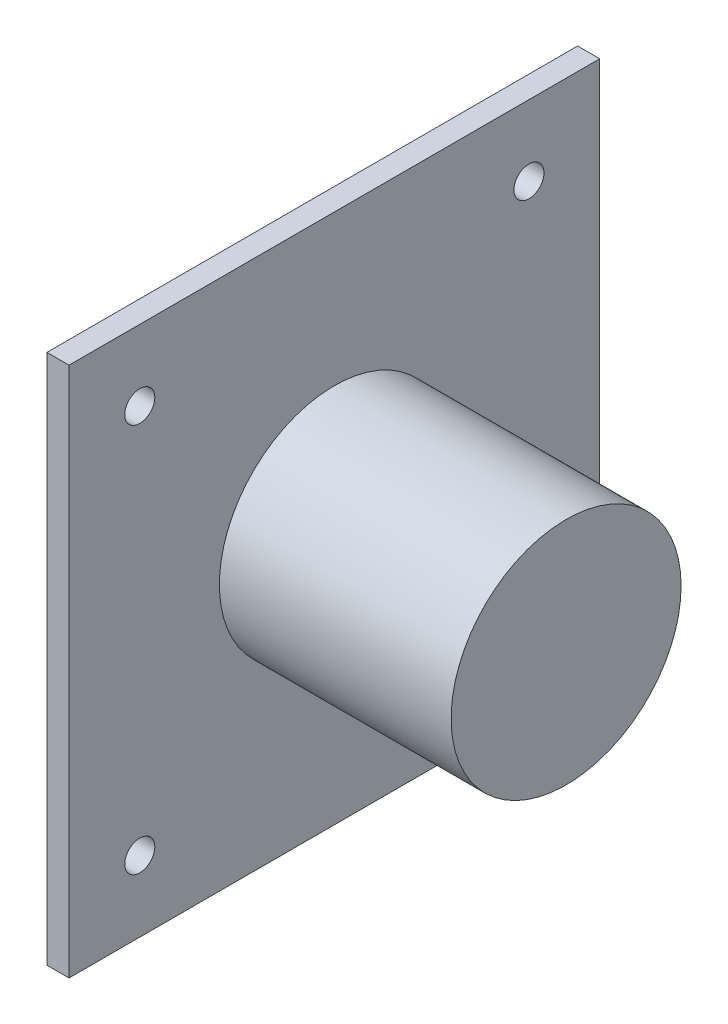
ISO-10303-21;
HEADER;
FILE_DESCRIPTION(('STEP AP214'),'2;1');
FILE_NAME('part.step','',(''),(''),'','','');
FILE_SCHEMA(('AUTOMOTIVE_DESIGN { 1 0 10303 214 1 1 1 1 }'));
ENDSEC;
DATA;
#1=APPLICATION_CONTEXT('core data for automotive mechanical design processes');
#2=APPLICATION_PROTOCOL_DEFINITION('international standard','automotive_design',2000,#1);
#3=PRODUCT_CONTEXT('',#1,'mechanical');
#4=PRODUCT('Part','Part','',(#3));
#5=PRODUCT_RELATED_PRODUCT_CATEGORY('part','',(#4));
#6=PRODUCT_DEFINITION_FORMATION('','',#4);
#7=PRODUCT_DEFINITION_CONTEXT('part definition',#1,'design');
#8=PRODUCT_DEFINITION('design','',#6,#7);
#9=PRODUCT_DEFINITION_SHAPE('','',#8);
#10=(LENGTH_UNIT() NAMED_UNIT(*) SI_UNIT(.MILLI.,.METRE.));
#11=(NAMED_UNIT(*) PLANE_ANGLE_UNIT() SI_UNIT($,.RADIAN.));
#12=(NAMED_UNIT(*) SI_UNIT($,.STERADIAN.) SOLID_ANGLE_UNIT());
#13=UNCERTAINTY_MEASURE_WITH_UNIT(LENGTH_MEASURE(1.E-05),#10,'distance_accuracy_value','');
#14=(GEOMETRIC_REPRESENTATION_CONTEXT(3) GLOBAL_UNCERTAINTY_ASSIGNED_CONTEXT((#13)) GLOBAL_UNIT_ASSIGNED_CONTEXT((#10,
#11,#12)) REPRESENTATION_CONTEXT('',''));
#15=CARTESIAN_POINT('',(0.,0.,0.));
#16=DIRECTION('',(0.,0.,1.));
#17=DIRECTION('',(1.,0.,0.));
#18=AXIS2_PLACEMENT_3D('',#15,#16,#17);
#19=CARTESIAN_POINT('',(0.,0.,0.));
#20=DIRECTION('',(-1.,0.,0.));
#21=DIRECTION('',(0.,0.,1.));
#22=AXIS2_PLACEMENT_3D('',#19,#20,#21);
#23=PLANE('',#22);
#24=CARTESIAN_POINT('',(0.,13.97,13.97));
#25=DIRECTION('',(1.,0.,0.));
#26=DIRECTION('',(0.,0.,-1.));
#27=AXIS2_PLACEMENT_3D('',#24,#25,#26);
#28=CIRCLE('',#27,1.0795);
#29=CARTESIAN_POINT('',(0.,13.97,12.8905));
#30=VERTEX_POINT('',#29);
#31=EDGE_CURVE('E145',#30,#30,#28,.T.);
#32=ORIENTED_EDGE('',*,*,#31,.T.);
#33=EDGE_LOOP('',(#32));
#34=FACE_BOUND('',#33,.T.);
#35=CARTESIAN_POINT('',(0.,-13.97,13.97));
#36=DIRECTION('',(1.,0.,0.));
#37=DIRECTION('',(0.,0.,-1.));
#38=AXIS2_PLACEMENT_3D('',#35,#36,#37);
#39=CIRCLE('',#38,1.0795);
#40=CARTESIAN_POINT('',(0.,-13.97,12.8905));
#41=VERTEX_POINT('',#40);
#42=EDGE_CURVE('E156',#41,#41,#39,.T.);
#43=ORIENTED_EDGE('',*,*,#42,.T.);
#44=EDGE_LOOP('',(#43));
#45=FACE_BOUND('',#44,.T.);
#46=DIRECTION('',(0.,1.,0.));
#47=VECTOR('',#46,1.);
#48=CARTESIAN_POINT('',(0.,-19.05,-19.05));
#49=LINE('',#48,#47);
#50=CARTESIAN_POINT('',(0.,-19.05,-19.05));
#51=VERTEX_POINT('',#50);
#52=CARTESIAN_POINT('',(0.,19.05,-19.05));
#53=VERTEX_POINT('',#52);
#54=EDGE_CURVE('E162',#51,#53,#49,.T.);
#55=ORIENTED_EDGE('',*,*,#54,.F.);
#56=DIRECTION('',(0.,0.,-1.));
#57=VECTOR('',#56,1.);
#58=CARTESIAN_POINT('',(0.,-19.05,19.05));
#59=LINE('',#58,#57);
#60=CARTESIAN_POINT('',(0.,-19.05,19.05));
#61=VERTEX_POINT('',#60);
#62=EDGE_CURVE('E81',#61,#51,#59,.T.);
#63=ORIENTED_EDGE('',*,*,#62,.F.);
#64=DIRECTION('',(0.,-1.,0.));
#65=VECTOR('',#64,1.);
#66=CARTESIAN_POINT('',(0.,-19.05,19.05));
#67=LINE('',#66,#65);
#68=CARTESIAN_POINT('',(0.,19.05,19.05));
#69=VERTEX_POINT('',#68);
#70=EDGE_CURVE('E176',#69,#61,#67,.T.);
#71=ORIENTED_EDGE('',*,*,#70,.F.);
#72=DIRECTION('',(0.,0.,1.));
#73=VECTOR('',#72,1.);
#74=CARTESIAN_POINT('',(0.,19.05,19.05));
#75=LINE('',#74,#73);
#76=EDGE_CURVE('E174',#53,#69,#75,.T.);
#77=ORIENTED_EDGE('',*,*,#76,.F.);
#78=EDGE_LOOP('',(#55,#63,#71,#77));
#79=FACE_BOUND('',#78,.T.);
#80=CARTESIAN_POINT('',(0.,-13.97,-13.97));
#81=DIRECTION('',(1.,0.,0.));
#82=DIRECTION('',(0.,0.,-1.));
#83=AXIS2_PLACEMENT_3D('',#80,#81,#82);
#84=CIRCLE('',#83,1.0795);
#85=CARTESIAN_POINT('',(0.,-13.97,-15.0495));
#86=VERTEX_POINT('',#85);
#87=EDGE_CURVE('E150',#86,#86,#84,.T.);
#88=ORIENTED_EDGE('',*,*,#87,.T.);
#89=EDGE_LOOP('',(#88));
#90=FACE_BOUND('',#89,.T.);
#91=CARTESIAN_POINT('',(0.,13.97,-13.97));
#92=DIRECTION('',(1.,0.,0.));
#93=DIRECTION('',(0.,0.,-1.));
#94=AXIS2_PLACEMENT_3D('',#91,#92,#93);
#95=CIRCLE('',#94,1.0795);
#96=CARTESIAN_POINT('',(0.,13.97,-15.0495));
#97=VERTEX_POINT('',#96);
#98=EDGE_CURVE('E136',#97,#97,#95,.T.);
#99=ORIENTED_EDGE('',*,*,#98,.T.);
#100=EDGE_LOOP('',(#99));
#101=FACE_BOUND('',#100,.T.);
#102=DIRECTION('',(0.,0.,1.));
#103=VECTOR('',#102,1.);
#104=CARTESIAN_POINT('',(0.,-15.24,-11.43));
#105=LINE('',#104,#103);
#106=CARTESIAN_POINT('',(0.,-15.24,-11.43));
#107=VERTEX_POINT('',#106);
#108=CARTESIAN_POINT('',(0.,-15.24,-1.27));
#109=VERTEX_POINT('',#108);
#110=EDGE_CURVE('E221',#107,#109,#105,.T.);
#111=ORIENTED_EDGE('',*,*,#110,.F.);
#112=DIRECTION('',(0.,-1.,0.));
#113=VECTOR('',#112,1.);
#114=CARTESIAN_POINT('',(0.,-15.24,-11.43));
#115=LINE('',#114,#113);
#116=CARTESIAN_POINT('',(0.,-10.16,-11.43));
#117=VERTEX_POINT('',#116);
#118=EDGE_CURVE('E134',#117,#107,#115,.T.);
#119=ORIENTED_EDGE('',*,*,#118,.F.);
#120=DIRECTION('',(0.,0.,-1.));
#121=VECTOR('',#120,1.);
#122=CARTESIAN_POINT('',(0.,-10.16,-11.43));
#123=LINE('',#122,#121);
#124=CARTESIAN_POINT('',(0.,-10.16,-1.27));
#125=VERTEX_POINT('',#124);
#126=EDGE_CURVE('E130',#125,#117,#123,.T.);
#127=ORIENTED_EDGE('',*,*,#126,.F.);
#128=DIRECTION('',(0.,1.,0.));
#129=VECTOR('',#128,1.);
#130=CARTESIAN_POINT('',(0.,-15.24,-1.27));
#131=LINE('',#130,#129);
#132=EDGE_CURVE('E223',#109,#125,#131,.T.);
#133=ORIENTED_EDGE('',*,*,#132,.F.);
#134=EDGE_LOOP('',(#111,#119,#127,#133));
#135=FACE_BOUND('',#134,.T.);
#136=ADVANCED_FACE('F35',(#34,#45,#79,#90,#101,#135),#23,.T.);
#137=CARTESIAN_POINT('',(1.5875,0.,0.));
#138=DIRECTION('',(-1.,0.,0.));
#139=DIRECTION('',(0.,0.,1.));
#140=AXIS2_PLACEMENT_3D('',#137,#138,#139);
#141=PLANE('',#140);
#142=CARTESIAN_POINT('',(1.5875,0.,0.));
#143=DIRECTION('',(1.,0.,0.));
#144=DIRECTION('',(0.,0.,-1.));
#145=AXIS2_PLACEMENT_3D('',#142,#143,#144);
#146=CIRCLE('',#145,8.255);
#147=CARTESIAN_POINT('',(1.5875,0.,-8.255));
#148=VERTEX_POINT('',#147);
#149=EDGE_CURVE('E11',#148,#148,#146,.T.);
#150=ORIENTED_EDGE('',*,*,#149,.F.);
#151=EDGE_LOOP('',(#150));
#152=FACE_BOUND('',#151,.T.);
#153=DIRECTION('',(0.,1.,0.));
#154=VECTOR('',#153,1.);
#155=CARTESIAN_POINT('',(1.5875,-19.05,-19.05));
#156=LINE('',#155,#154);
#157=CARTESIAN_POINT('',(1.5875,-19.05,-19.05));
#158=VERTEX_POINT('',#157);
#159=CARTESIAN_POINT('',(1.5875,19.05,-19.05));
#160=VERTEX_POINT('',#159);
#161=EDGE_CURVE('E165',#158,#160,#156,.T.);
#162=ORIENTED_EDGE('',*,*,#161,.T.);
#163=DIRECTION('',(0.,0.,1.));
#164=VECTOR('',#163,1.);
#165=CARTESIAN_POINT('',(1.5875,19.05,19.05));
#166=LINE('',#165,#164);
#167=CARTESIAN_POINT('',(1.5875,19.05,19.05));
#168=VERTEX_POINT('',#167);
#169=EDGE_CURVE('E89',#160,#168,#166,.T.);
#170=ORIENTED_EDGE('',*,*,#169,.T.);
#171=DIRECTION('',(0.,-1.,0.));
#172=VECTOR('',#171,1.);
#173=CARTESIAN_POINT('',(1.5875,-19.05,19.05));
#174=LINE('',#173,#172);
#175=CARTESIAN_POINT('',(1.5875,-19.05,19.05));
#176=VERTEX_POINT('',#175);
#177=EDGE_CURVE('E168',#168,#176,#174,.T.);
#178=ORIENTED_EDGE('',*,*,#177,.T.);
#179=DIRECTION('',(0.,0.,-1.));
#180=VECTOR('',#179,1.);
#181=CARTESIAN_POINT('',(1.5875,-19.05,19.05));
#182=LINE('',#181,#180);
#183=EDGE_CURVE('E60',#176,#158,#182,.T.);
#184=ORIENTED_EDGE('',*,*,#183,.T.);
#185=EDGE_LOOP('',(#162,#170,#178,#184));
#186=FACE_BOUND('',#185,.T.);
#187=CARTESIAN_POINT('',(1.5875,-13.97,13.97));
#188=DIRECTION('',(1.,0.,0.));
#189=DIRECTION('',(0.,0.,-1.));
#190=AXIS2_PLACEMENT_3D('',#187,#188,#189);
#191=CIRCLE('',#190,1.0795);
#192=CARTESIAN_POINT('',(1.5875,-13.97,12.8905));
#193=VERTEX_POINT('',#192);
#194=EDGE_CURVE('E159',#193,#193,#191,.T.);
#195=ORIENTED_EDGE('',*,*,#194,.F.);
#196=EDGE_LOOP('',(#195));
#197=FACE_BOUND('',#196,.T.);
#198=CARTESIAN_POINT('',(1.5875,-13.97,-13.97));
#199=DIRECTION('',(1.,0.,0.));
#200=DIRECTION('',(0.,0.,-1.));
#201=AXIS2_PLACEMENT_3D('',#198,#199,#200);
#202=CIRCLE('',#201,1.0795);
#203=CARTESIAN_POINT('',(1.5875,-13.97,-15.0495));
#204=VERTEX_POINT('',#203);
#205=EDGE_CURVE('E153',#204,#204,#202,.T.);
#206=ORIENTED_EDGE('',*,*,#205,.F.);
#207=EDGE_LOOP('',(#206));
#208=FACE_BOUND('',#207,.T.);
#209=CARTESIAN_POINT('',(1.5875,13.97,13.97));
#210=DIRECTION('',(1.,0.,0.));
#211=DIRECTION('',(0.,0.,-1.));
#212=AXIS2_PLACEMENT_3D('',#209,#210,#211);
#213=CIRCLE('',#212,1.0795);
#214=CARTESIAN_POINT('',(1.5875,13.97,12.8905));
#215=VERTEX_POINT('',#214);
#216=EDGE_CURVE('E147',#215,#215,#213,.T.);
#217=ORIENTED_EDGE('',*,*,#216,.F.);
#218=EDGE_LOOP('',(#217));
#219=FACE_BOUND('',#218,.T.);
#220=CARTESIAN_POINT('',(1.5875,13.97,-13.97));
#221=DIRECTION('',(1.,0.,0.));
#222=DIRECTION('',(0.,0.,-1.));
#223=AXIS2_PLACEMENT_3D('',#220,#221,#222);
#224=CIRCLE('',#223,1.0795);
#225=CARTESIAN_POINT('',(1.5875,13.97,-15.0495));
#226=VERTEX_POINT('',#225);
#227=EDGE_CURVE('E139',#226,#226,#224,.T.);
#228=ORIENTED_EDGE('',*,*,#227,.F.);
#229=EDGE_LOOP('',(#228));
#230=FACE_BOUND('',#229,.T.);
#231=ADVANCED_FACE('F196',(#152,#186,#197,#208,#219,#230),#141,.F.);
#232=CARTESIAN_POINT('',(1.5875,-19.05,-19.05));
#233=DIRECTION('',(0.,0.,1.));
#234=DIRECTION('',(1.,0.,0.));
#235=AXIS2_PLACEMENT_3D('',#232,#233,#234);
#236=PLANE('',#235);
#237=ORIENTED_EDGE('',*,*,#54,.T.);
#238=DIRECTION('',(-1.,0.,0.));
#239=VECTOR('',#238,1.);
#240=CARTESIAN_POINT('',(1.5875,19.05,-19.05));
#241=LINE('',#240,#239);
#242=EDGE_CURVE('E39',#160,#53,#241,.T.);
#243=ORIENTED_EDGE('',*,*,#242,.F.);
#244=ORIENTED_EDGE('',*,*,#161,.F.);
#245=DIRECTION('',(-1.,0.,0.));
#246=VECTOR('',#245,1.);
#247=CARTESIAN_POINT('',(1.5875,-19.05,-19.05));
#248=LINE('',#247,#246);
#249=EDGE_CURVE('E171',#158,#51,#248,.T.);
#250=ORIENTED_EDGE('',*,*,#249,.T.);
#251=EDGE_LOOP('',(#237,#243,#244,#250));
#252=FACE_BOUND('',#251,.T.);
#253=ADVANCED_FACE('F37',(#252),#236,.F.);
#254=CARTESIAN_POINT('',(1.5875,19.05,19.05));
#255=DIRECTION('',(0.,-1.,0.));
#256=DIRECTION('',(0.,0.,-1.));
#257=AXIS2_PLACEMENT_3D('',#254,#255,#256);
#258=PLANE('',#257);
#259=ORIENTED_EDGE('',*,*,#76,.T.);
#260=DIRECTION('',(-1.,0.,0.));
#261=VECTOR('',#260,1.);
#262=CARTESIAN_POINT('',(1.5875,19.05,19.05));
#263=LINE('',#262,#261);
#264=EDGE_CURVE('E181',#168,#69,#263,.T.);
#265=ORIENTED_EDGE('',*,*,#264,.F.);
#266=ORIENTED_EDGE('',*,*,#169,.F.);
#267=ORIENTED_EDGE('',*,*,#242,.T.);
#268=EDGE_LOOP('',(#259,#265,#266,#267));
#269=FACE_BOUND('',#268,.T.);
#270=ADVANCED_FACE('F187',(#269),#258,.F.);
#271=CARTESIAN_POINT('',(1.5875,-19.05,19.05));
#272=DIRECTION('',(0.,0.,-1.));
#273=DIRECTION('',(-1.,0.,0.));
#274=AXIS2_PLACEMENT_3D('',#271,#272,#273);
#275=PLANE('',#274);
#276=ORIENTED_EDGE('',*,*,#70,.T.);
#277=DIRECTION('',(-1.,0.,0.));
#278=VECTOR('',#277,1.);
#279=CARTESIAN_POINT('',(1.5875,-19.05,19.05));
#280=LINE('',#279,#278);
#281=EDGE_CURVE('E180',#176,#61,#280,.T.);
#282=ORIENTED_EDGE('',*,*,#281,.F.);
#283=ORIENTED_EDGE('',*,*,#177,.F.);
#284=ORIENTED_EDGE('',*,*,#264,.T.);
#285=EDGE_LOOP('',(#276,#282,#283,#284));
#286=FACE_BOUND('',#285,.T.);
#287=ADVANCED_FACE('F194',(#286),#275,.F.);
#288=CARTESIAN_POINT('',(1.5875,-19.05,19.05));
#289=DIRECTION('',(0.,1.,0.));
#290=DIRECTION('',(0.,0.,1.));
#291=AXIS2_PLACEMENT_3D('',#288,#289,#290);
#292=PLANE('',#291);
#293=ORIENTED_EDGE('',*,*,#62,.T.);
#294=ORIENTED_EDGE('',*,*,#249,.F.);
#295=ORIENTED_EDGE('',*,*,#183,.F.);
#296=ORIENTED_EDGE('',*,*,#281,.T.);
#297=EDGE_LOOP('',(#293,#294,#295,#296));
#298=FACE_BOUND('',#297,.T.);
#299=ADVANCED_FACE('F195',(#298),#292,.F.);
#300=CARTESIAN_POINT('',(1.5875,-13.97,13.97));
#301=DIRECTION('',(-1.,0.,0.));
#302=DIRECTION('',(0.,0.,1.));
#303=AXIS2_PLACEMENT_3D('',#300,#301,#302);
#304=CYLINDRICAL_SURFACE('',#303,1.0795);
#305=ORIENTED_EDGE('',*,*,#194,.T.);
#306=EDGE_LOOP('',(#305));
#307=FACE_BOUND('',#306,.T.);
#308=ORIENTED_EDGE('',*,*,#42,.F.);
#309=EDGE_LOOP('',(#308));
#310=FACE_BOUND('',#309,.T.);
#311=ADVANCED_FACE('F268',(#307,#310),#304,.F.);
#312=CARTESIAN_POINT('',(1.5875,-13.97,-13.97));
#313=DIRECTION('',(-1.,0.,0.));
#314=DIRECTION('',(0.,0.,1.));
#315=AXIS2_PLACEMENT_3D('',#312,#313,#314);
#316=CYLINDRICAL_SURFACE('',#315,1.0795);
#317=ORIENTED_EDGE('',*,*,#205,.T.);
#318=EDGE_LOOP('',(#317));
#319=FACE_BOUND('',#318,.T.);
#320=ORIENTED_EDGE('',*,*,#87,.F.);
#321=EDGE_LOOP('',(#320));
#322=FACE_BOUND('',#321,.T.);
#323=ADVANCED_FACE('F264',(#319,#322),#316,.F.);
#324=CARTESIAN_POINT('',(1.5875,13.97,13.97));
#325=DIRECTION('',(-1.,0.,0.));
#326=DIRECTION('',(0.,0.,1.));
#327=AXIS2_PLACEMENT_3D('',#324,#325,#326);
#328=CYLINDRICAL_SURFACE('',#327,1.0795);
#329=ORIENTED_EDGE('',*,*,#216,.T.);
#330=EDGE_LOOP('',(#329));
#331=FACE_BOUND('',#330,.T.);
#332=ORIENTED_EDGE('',*,*,#31,.F.);
#333=EDGE_LOOP('',(#332));
#334=FACE_BOUND('',#333,.T.);
#335=ADVANCED_FACE('F212',(#331,#334),#328,.F.);
#336=CARTESIAN_POINT('',(1.5875,13.97,-13.97));
#337=DIRECTION('',(-1.,0.,0.));
#338=DIRECTION('',(0.,0.,1.));
#339=AXIS2_PLACEMENT_3D('',#336,#337,#338);
#340=CYLINDRICAL_SURFACE('',#339,1.0795);
#341=ORIENTED_EDGE('',*,*,#227,.T.);
#342=EDGE_LOOP('',(#341));
#343=FACE_BOUND('',#342,.T.);
#344=ORIENTED_EDGE('',*,*,#98,.F.);
#345=EDGE_LOOP('',(#344));
#346=FACE_BOUND('',#345,.T.);
#347=ADVANCED_FACE('F209',(#343,#346),#340,.F.);
#348=CARTESIAN_POINT('',(-8.89,-15.24,-11.43));
#349=DIRECTION('',(0.,0.,1.));
#350=DIRECTION('',(1.,0.,0.));
#351=AXIS2_PLACEMENT_3D('',#348,#349,#350);
#352=PLANE('',#351);
#353=ORIENTED_EDGE('',*,*,#118,.T.);
#354=DIRECTION('',(1.,0.,0.));
#355=VECTOR('',#354,1.);
#356=CARTESIAN_POINT('',(-8.89,-15.24,-11.43));
#357=LINE('',#356,#355);
#358=CARTESIAN_POINT('',(-8.89,-15.24,-11.43));
#359=VERTEX_POINT('',#358);
#360=EDGE_CURVE('E115',#359,#107,#357,.T.);
#361=ORIENTED_EDGE('',*,*,#360,.F.);
#362=DIRECTION('',(0.,-1.,0.));
#363=VECTOR('',#362,1.);
#364=CARTESIAN_POINT('',(-8.89,-15.24,-11.43));
#365=LINE('',#364,#363);
#366=CARTESIAN_POINT('',(-8.89,-10.16,-11.43));
#367=VERTEX_POINT('',#366);
#368=EDGE_CURVE('E122',#367,#359,#365,.T.);
#369=ORIENTED_EDGE('',*,*,#368,.F.);
#370=DIRECTION('',(1.,0.,0.));
#371=VECTOR('',#370,1.);
#372=CARTESIAN_POINT('',(-8.89,-10.16,-11.43));
#373=LINE('',#372,#371);
#374=EDGE_CURVE('E231',#367,#117,#373,.T.);
#375=ORIENTED_EDGE('',*,*,#374,.T.);
#376=EDGE_LOOP('',(#353,#361,#369,#375));
#377=FACE_BOUND('',#376,.T.);
#378=ADVANCED_FACE('F132',(#377),#352,.F.);
#379=CARTESIAN_POINT('',(-8.89,-15.24,-11.43));
#380=DIRECTION('',(0.,1.,0.));
#381=DIRECTION('',(0.,0.,1.));
#382=AXIS2_PLACEMENT_3D('',#379,#380,#381);
#383=PLANE('',#382);
#384=ORIENTED_EDGE('',*,*,#110,.T.);
#385=DIRECTION('',(1.,0.,0.));
#386=VECTOR('',#385,1.);
#387=CARTESIAN_POINT('',(-8.89,-15.24,-1.27));
#388=LINE('',#387,#386);
#389=CARTESIAN_POINT('',(-8.89,-15.24,-1.27));
#390=VERTEX_POINT('',#389);
#391=EDGE_CURVE('E118',#390,#109,#388,.T.);
#392=ORIENTED_EDGE('',*,*,#391,.F.);
#393=DIRECTION('',(0.,0.,1.));
#394=VECTOR('',#393,1.);
#395=CARTESIAN_POINT('',(-8.89,-15.24,-11.43));
#396=LINE('',#395,#394);
#397=EDGE_CURVE('E111',#359,#390,#396,.T.);
#398=ORIENTED_EDGE('',*,*,#397,.F.);
#399=ORIENTED_EDGE('',*,*,#360,.T.);
#400=EDGE_LOOP('',(#384,#392,#398,#399));
#401=FACE_BOUND('',#400,.T.);
#402=ADVANCED_FACE('F113',(#401),#383,.F.);
#403=CARTESIAN_POINT('',(-8.89,-15.24,-1.27));
#404=DIRECTION('',(0.,0.,-1.));
#405=DIRECTION('',(-1.,0.,0.));
#406=AXIS2_PLACEMENT_3D('',#403,#404,#405);
#407=PLANE('',#406);
#408=ORIENTED_EDGE('',*,*,#132,.T.);
#409=DIRECTION('',(1.,0.,0.));
#410=VECTOR('',#409,1.);
#411=CARTESIAN_POINT('',(-8.89,-10.16,-1.27));
#412=LINE('',#411,#410);
#413=CARTESIAN_POINT('',(-8.89,-10.16,-1.27));
#414=VERTEX_POINT('',#413);
#415=EDGE_CURVE('E51',#414,#125,#412,.T.);
#416=ORIENTED_EDGE('',*,*,#415,.F.);
#417=DIRECTION('',(0.,1.,0.));
#418=VECTOR('',#417,1.);
#419=CARTESIAN_POINT('',(-8.89,-15.24,-1.27));
#420=LINE('',#419,#418);
#421=EDGE_CURVE('E121',#390,#414,#420,.T.);
#422=ORIENTED_EDGE('',*,*,#421,.F.);
#423=ORIENTED_EDGE('',*,*,#391,.T.);
#424=EDGE_LOOP('',(#408,#416,#422,#423));
#425=FACE_BOUND('',#424,.T.);
#426=ADVANCED_FACE('F254',(#425),#407,.F.);
#427=CARTESIAN_POINT('',(-8.89,-10.16,-11.43));
#428=DIRECTION('',(0.,-1.,0.));
#429=DIRECTION('',(0.,0.,-1.));
#430=AXIS2_PLACEMENT_3D('',#427,#428,#429);
#431=PLANE('',#430);
#432=ORIENTED_EDGE('',*,*,#126,.T.);
#433=ORIENTED_EDGE('',*,*,#374,.F.);
#434=DIRECTION('',(0.,0.,-1.));
#435=VECTOR('',#434,1.);
#436=CARTESIAN_POINT('',(-8.89,-10.16,-11.43));
#437=LINE('',#436,#435);
#438=EDGE_CURVE('E126',#414,#367,#437,.T.);
#439=ORIENTED_EDGE('',*,*,#438,.F.);
#440=ORIENTED_EDGE('',*,*,#415,.T.);
#441=EDGE_LOOP('',(#432,#433,#439,#440));
#442=FACE_BOUND('',#441,.T.);
#443=ADVANCED_FACE('F249',(#442),#431,.F.);
#444=CARTESIAN_POINT('',(-8.89,0.,0.));
#445=DIRECTION('',(1.,0.,0.));
#446=DIRECTION('',(0.,0.,-1.));
#447=AXIS2_PLACEMENT_3D('',#444,#445,#446);
#448=PLANE('',#447);
#449=ORIENTED_EDGE('',*,*,#368,.T.);
#450=ORIENTED_EDGE('',*,*,#397,.T.);
#451=ORIENTED_EDGE('',*,*,#421,.T.);
#452=ORIENTED_EDGE('',*,*,#438,.T.);
#453=EDGE_LOOP('',(#449,#450,#451,#452));
#454=FACE_BOUND('',#453,.T.);
#455=ADVANCED_FACE('F125',(#454),#448,.F.);
#456=CARTESIAN_POINT('',(18.2245,0.,0.));
#457=DIRECTION('',(-1.,0.,0.));
#458=DIRECTION('',(0.,0.,1.));
#459=AXIS2_PLACEMENT_3D('',#456,#457,#458);
#460=CYLINDRICAL_SURFACE('',#459,8.255);
#461=CARTESIAN_POINT('',(18.2245,0.,0.));
#462=DIRECTION('',(1.,0.,0.));
#463=DIRECTION('',(0.,0.,-1.));
#464=AXIS2_PLACEMENT_3D('',#461,#462,#463);
#465=CIRCLE('',#464,8.255);
#466=CARTESIAN_POINT('',(18.2245,0.,-8.255));
#467=VERTEX_POINT('',#466);
#468=EDGE_CURVE('E226',#467,#467,#465,.T.);
#469=ORIENTED_EDGE('',*,*,#468,.F.);
#470=EDGE_LOOP('',(#469));
#471=FACE_BOUND('',#470,.T.);
#472=ORIENTED_EDGE('',*,*,#149,.T.);
#473=EDGE_LOOP('',(#472));
#474=FACE_BOUND('',#473,.T.);
#475=ADVANCED_FACE('F239',(#471,#474),#460,.T.);
#476=CARTESIAN_POINT('',(18.2245,0.,0.));
#477=DIRECTION('',(1.,0.,0.));
#478=DIRECTION('',(0.,0.,-1.));
#479=AXIS2_PLACEMENT_3D('',#476,#477,#478);
#480=PLANE('',#479);
#481=ORIENTED_EDGE('',*,*,#468,.T.);
#482=EDGE_LOOP('',(#481));
#483=FACE_BOUND('',#482,.T.);
#484=ADVANCED_FACE('F237',(#483),#480,.T.);
#485=CLOSED_SHELL('',(#136,#231,#253,#270,#287,#299,#311,#323,#335,#347,#378,#402,#426,#443,
#455,#475,#484));
#486=MANIFOLD_SOLID_BREP('B2',#485);
#487=ADVANCED_BREP_SHAPE_REPRESENTATION('',(#18,#486),#14);
#488=SHAPE_DEFINITION_REPRESENTATION(#9,#487);
ENDSEC;
END-ISO-10303-21;
